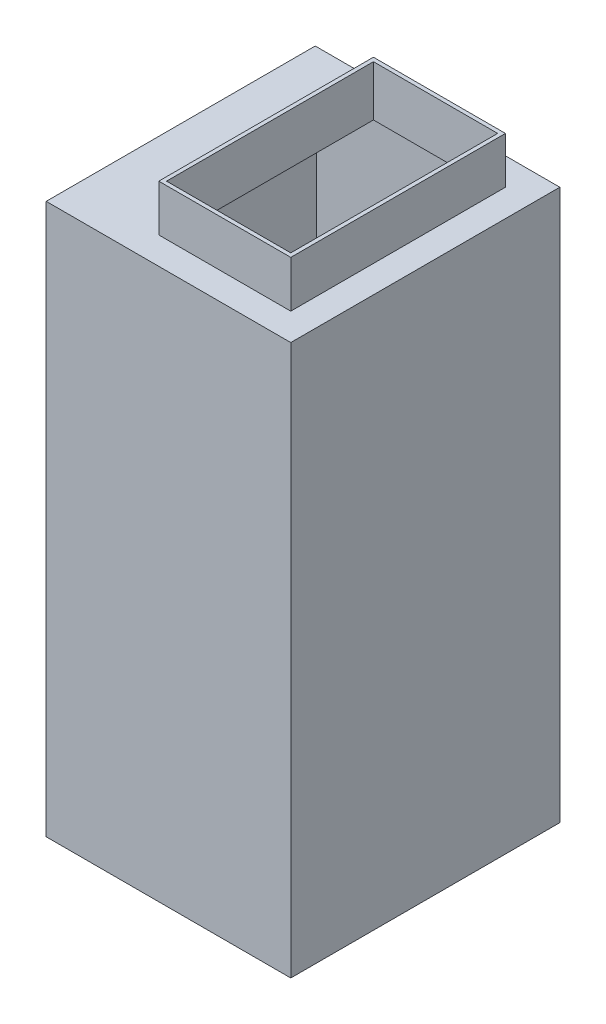
ISO-10303-21;
HEADER;
FILE_DESCRIPTION(('STEP AP214'),'2;1');
FILE_NAME('part.step','',(''),(''),'','','');
FILE_SCHEMA(('AUTOMOTIVE_DESIGN { 1 0 10303 214 1 1 1 1 }'));
ENDSEC;
DATA;
#1=APPLICATION_CONTEXT('core data for automotive mechanical design processes');
#2=APPLICATION_PROTOCOL_DEFINITION('international standard','automotive_design',2000,#1);
#3=PRODUCT_CONTEXT('',#1,'mechanical');
#4=PRODUCT('Part','Part','',(#3));
#5=PRODUCT_RELATED_PRODUCT_CATEGORY('part','',(#4));
#6=PRODUCT_DEFINITION_FORMATION('','',#4);
#7=PRODUCT_DEFINITION_CONTEXT('part definition',#1,'design');
#8=PRODUCT_DEFINITION('design','',#6,#7);
#9=PRODUCT_DEFINITION_SHAPE('','',#8);
#10=(LENGTH_UNIT() NAMED_UNIT(*) SI_UNIT(.MILLI.,.METRE.));
#11=(NAMED_UNIT(*) PLANE_ANGLE_UNIT() SI_UNIT($,.RADIAN.));
#12=(NAMED_UNIT(*) SI_UNIT($,.STERADIAN.) SOLID_ANGLE_UNIT());
#13=UNCERTAINTY_MEASURE_WITH_UNIT(LENGTH_MEASURE(1.E-05),#10,'distance_accuracy_value','');
#14=(GEOMETRIC_REPRESENTATION_CONTEXT(3) GLOBAL_UNCERTAINTY_ASSIGNED_CONTEXT((#13)) GLOBAL_UNIT_ASSIGNED_CONTEXT((#10,
#11,#12)) REPRESENTATION_CONTEXT('',''));
#15=CARTESIAN_POINT('',(0.,0.,0.));
#16=DIRECTION('',(0.,0.,1.));
#17=DIRECTION('',(1.,0.,0.));
#18=AXIS2_PLACEMENT_3D('',#15,#16,#17);
#19=CARTESIAN_POINT('',(-96.825,221.825,-108.));
#20=DIRECTION('',(-1.,0.,0.));
#21=DIRECTION('',(0.,-1.,0.));
#22=AXIS2_PLACEMENT_3D('',#19,#20,#21);
#23=PLANE('',#22);
#24=DIRECTION('',(0.,-1.,0.));
#25=VECTOR('',#24,1.);
#26=CARTESIAN_POINT('',(-96.825,221.825,108.));
#27=LINE('',#26,#25);
#28=CARTESIAN_POINT('',(-96.825,221.825,108.));
#29=VERTEX_POINT('',#28);
#30=CARTESIAN_POINT('',(-96.8249999999999,-221.825,108.));
#31=VERTEX_POINT('',#30);
#32=EDGE_CURVE('E218',#29,#31,#27,.T.);
#33=ORIENTED_EDGE('',*,*,#32,.T.);
#34=DIRECTION('',(0.,0.,1.));
#35=VECTOR('',#34,1.);
#36=CARTESIAN_POINT('',(-96.8249999999999,-221.825,-108.));
#37=LINE('',#36,#35);
#38=CARTESIAN_POINT('',(-96.8249999999999,-221.825,-108.));
#39=VERTEX_POINT('',#38);
#40=EDGE_CURVE('E232',#39,#31,#37,.T.);
#41=ORIENTED_EDGE('',*,*,#40,.F.);
#42=DIRECTION('',(0.,-1.,0.));
#43=VECTOR('',#42,1.);
#44=CARTESIAN_POINT('',(-96.825,221.825,-108.));
#45=LINE('',#44,#43);
#46=CARTESIAN_POINT('',(-96.825,221.825,-108.));
#47=VERTEX_POINT('',#46);
#48=EDGE_CURVE('E219',#47,#39,#45,.T.);
#49=ORIENTED_EDGE('',*,*,#48,.F.);
#50=DIRECTION('',(0.,0.,1.));
#51=VECTOR('',#50,1.);
#52=CARTESIAN_POINT('',(-96.825,221.825,-108.));
#53=LINE('',#52,#51);
#54=EDGE_CURVE('E243',#47,#29,#53,.T.);
#55=ORIENTED_EDGE('',*,*,#54,.T.);
#56=EDGE_LOOP('',(#33,#41,#49,#55));
#57=FACE_BOUND('',#56,.T.);
#58=ADVANCED_FACE('F36',(#57),#23,.F.);
#59=CARTESIAN_POINT('',(-96.825,221.825,-108.));
#60=DIRECTION('',(0.,1.,0.));
#61=DIRECTION('',(0.,0.,1.));
#62=AXIS2_PLACEMENT_3D('',#59,#60,#61);
#63=PLANE('',#62);
#64=DIRECTION('',(-1.,0.,0.));
#65=VECTOR('',#64,1.);
#66=CARTESIAN_POINT('',(-27.,221.825,-84.6));
#67=LINE('',#66,#65);
#68=CARTESIAN_POINT('',(74.6,221.825,-84.6));
#69=VERTEX_POINT('',#68);
#70=CARTESIAN_POINT('',(-27.,221.825,-84.6));
#71=VERTEX_POINT('',#70);
#72=EDGE_CURVE('E157',#69,#71,#67,.T.);
#73=ORIENTED_EDGE('',*,*,#72,.T.);
#74=DIRECTION('',(0.,0.,1.));
#75=VECTOR('',#74,1.);
#76=CARTESIAN_POINT('',(-27.,221.825,-84.6));
#77=LINE('',#76,#75);
#78=CARTESIAN_POINT('',(-27.,221.825,84.6));
#79=VERTEX_POINT('',#78);
#80=EDGE_CURVE('E151',#71,#79,#77,.T.);
#81=ORIENTED_EDGE('',*,*,#80,.T.);
#82=DIRECTION('',(1.,0.,0.));
#83=VECTOR('',#82,1.);
#84=CARTESIAN_POINT('',(-27.,221.825,84.6));
#85=LINE('',#84,#83);
#86=CARTESIAN_POINT('',(74.6,221.825,84.6));
#87=VERTEX_POINT('',#86);
#88=EDGE_CURVE('E160',#79,#87,#85,.T.);
#89=ORIENTED_EDGE('',*,*,#88,.T.);
#90=DIRECTION('',(0.,0.,-1.));
#91=VECTOR('',#90,1.);
#92=CARTESIAN_POINT('',(74.6,221.825,-84.6));
#93=LINE('',#92,#91);
#94=EDGE_CURVE('E51',#87,#69,#93,.T.);
#95=ORIENTED_EDGE('',*,*,#94,.T.);
#96=EDGE_LOOP('',(#73,#81,#89,#95));
#97=FACE_BOUND('',#96,.T.);
#98=DIRECTION('',(-1.,0.,0.));
#99=VECTOR('',#98,1.);
#100=CARTESIAN_POINT('',(-96.825,221.825,108.));
#101=LINE('',#100,#99);
#102=CARTESIAN_POINT('',(96.825,221.825,108.));
#103=VERTEX_POINT('',#102);
#104=EDGE_CURVE('E223',#103,#29,#101,.T.);
#105=ORIENTED_EDGE('',*,*,#104,.T.);
#106=ORIENTED_EDGE('',*,*,#54,.F.);
#107=DIRECTION('',(-1.,0.,0.));
#108=VECTOR('',#107,1.);
#109=CARTESIAN_POINT('',(-96.825,221.825,-108.));
#110=LINE('',#109,#108);
#111=CARTESIAN_POINT('',(96.825,221.825,-108.));
#112=VERTEX_POINT('',#111);
#113=EDGE_CURVE('E229',#112,#47,#110,.T.);
#114=ORIENTED_EDGE('',*,*,#113,.F.);
#115=DIRECTION('',(0.,0.,1.));
#116=VECTOR('',#115,1.);
#117=CARTESIAN_POINT('',(96.825,221.825,-108.));
#118=LINE('',#117,#116);
#119=EDGE_CURVE('E246',#112,#103,#118,.T.);
#120=ORIENTED_EDGE('',*,*,#119,.T.);
#121=EDGE_LOOP('',(#105,#106,#114,#120));
#122=FACE_BOUND('',#121,.T.);
#123=ADVANCED_FACE('F164',(#97,#122),#63,.F.);
#124=CARTESIAN_POINT('',(96.825,221.825,-108.));
#125=DIRECTION('',(1.,0.,0.));
#126=DIRECTION('',(0.,1.,0.));
#127=AXIS2_PLACEMENT_3D('',#124,#125,#126);
#128=PLANE('',#127);
#129=DIRECTION('',(0.,1.,0.));
#130=VECTOR('',#129,1.);
#131=CARTESIAN_POINT('',(96.825,221.825,108.));
#132=LINE('',#131,#130);
#133=CARTESIAN_POINT('',(96.8250000000001,-221.825,108.));
#134=VERTEX_POINT('',#133);
#135=EDGE_CURVE('E238',#134,#103,#132,.T.);
#136=ORIENTED_EDGE('',*,*,#135,.T.);
#137=ORIENTED_EDGE('',*,*,#119,.F.);
#138=DIRECTION('',(0.,1.,0.));
#139=VECTOR('',#138,1.);
#140=CARTESIAN_POINT('',(96.825,221.825,-108.));
#141=LINE('',#140,#139);
#142=CARTESIAN_POINT('',(96.8250000000001,-221.825,-108.));
#143=VERTEX_POINT('',#142);
#144=EDGE_CURVE('E226',#143,#112,#141,.T.);
#145=ORIENTED_EDGE('',*,*,#144,.F.);
#146=DIRECTION('',(0.,0.,1.));
#147=VECTOR('',#146,1.);
#148=CARTESIAN_POINT('',(96.8250000000001,-221.825,-108.));
#149=LINE('',#148,#147);
#150=EDGE_CURVE('E248',#143,#134,#149,.T.);
#151=ORIENTED_EDGE('',*,*,#150,.T.);
#152=EDGE_LOOP('',(#136,#137,#145,#151));
#153=FACE_BOUND('',#152,.T.);
#154=ADVANCED_FACE('F308',(#153),#128,.F.);
#155=CARTESIAN_POINT('',(-96.8249999999999,-221.825,-108.));
#156=DIRECTION('',(0.,-1.,0.));
#157=DIRECTION('',(0.,0.,-1.));
#158=AXIS2_PLACEMENT_3D('',#155,#156,#157);
#159=PLANE('',#158);
#160=DIRECTION('',(1.,0.,0.));
#161=VECTOR('',#160,1.);
#162=CARTESIAN_POINT('',(-96.8249999999999,-221.825,108.));
#163=LINE('',#162,#161);
#164=EDGE_CURVE('E235',#31,#134,#163,.T.);
#165=ORIENTED_EDGE('',*,*,#164,.T.);
#166=ORIENTED_EDGE('',*,*,#150,.F.);
#167=DIRECTION('',(1.,0.,0.));
#168=VECTOR('',#167,1.);
#169=CARTESIAN_POINT('',(-96.8249999999999,-221.825,-108.));
#170=LINE('',#169,#168);
#171=EDGE_CURVE('E222',#39,#143,#170,.T.);
#172=ORIENTED_EDGE('',*,*,#171,.F.);
#173=ORIENTED_EDGE('',*,*,#40,.T.);
#174=EDGE_LOOP('',(#165,#166,#172,#173));
#175=FACE_BOUND('',#174,.T.);
#176=ADVANCED_FACE('F312',(#175),#159,.F.);
#177=CARTESIAN_POINT('',(0.,0.,-108.));
#178=DIRECTION('',(0.,0.,1.));
#179=DIRECTION('',(1.,0.,0.));
#180=AXIS2_PLACEMENT_3D('',#177,#178,#179);
#181=PLANE('',#180);
#182=ORIENTED_EDGE('',*,*,#48,.T.);
#183=ORIENTED_EDGE('',*,*,#171,.T.);
#184=ORIENTED_EDGE('',*,*,#144,.T.);
#185=ORIENTED_EDGE('',*,*,#113,.T.);
#186=EDGE_LOOP('',(#182,#183,#184,#185));
#187=FACE_BOUND('',#186,.T.);
#188=ADVANCED_FACE('F354',(#187),#181,.T.);
#189=CARTESIAN_POINT('',(0.,0.,108.));
#190=DIRECTION('',(0.,0.,1.));
#191=DIRECTION('',(1.,0.,0.));
#192=AXIS2_PLACEMENT_3D('',#189,#190,#191);
#193=PLANE('',#192);
#194=ORIENTED_EDGE('',*,*,#32,.F.);
#195=ORIENTED_EDGE('',*,*,#104,.F.);
#196=ORIENTED_EDGE('',*,*,#135,.F.);
#197=ORIENTED_EDGE('',*,*,#164,.F.);
#198=EDGE_LOOP('',(#194,#195,#196,#197));
#199=FACE_BOUND('',#198,.T.);
#200=ADVANCED_FACE('F334',(#199),#193,.F.);
#201=CARTESIAN_POINT('',(-27.,221.825,-84.6));
#202=DIRECTION('',(-1.,0.,0.));
#203=DIRECTION('',(0.,0.,1.));
#204=AXIS2_PLACEMENT_3D('',#201,#202,#203);
#205=PLANE('',#204);
#206=DIRECTION('',(0.,0.,1.));
#207=VECTOR('',#206,1.);
#208=CARTESIAN_POINT('',(-27.,263.1,-84.6));
#209=LINE('',#208,#207);
#210=CARTESIAN_POINT('',(-27.,263.1,-84.6));
#211=VERTEX_POINT('',#210);
#212=CARTESIAN_POINT('',(-27.,263.1,84.6));
#213=VERTEX_POINT('',#212);
#214=EDGE_CURVE('E59',#211,#213,#209,.T.);
#215=ORIENTED_EDGE('',*,*,#214,.T.);
#216=DIRECTION('',(0.,1.,0.));
#217=VECTOR('',#216,1.);
#218=CARTESIAN_POINT('',(-27.,221.825,84.6));
#219=LINE('',#218,#217);
#220=EDGE_CURVE('E147',#79,#213,#219,.T.);
#221=ORIENTED_EDGE('',*,*,#220,.F.);
#222=ORIENTED_EDGE('',*,*,#80,.F.);
#223=DIRECTION('',(0.,1.,0.));
#224=VECTOR('',#223,1.);
#225=CARTESIAN_POINT('',(-27.,221.825,-84.6));
#226=LINE('',#225,#224);
#227=EDGE_CURVE('E180',#71,#211,#226,.T.);
#228=ORIENTED_EDGE('',*,*,#227,.T.);
#229=EDGE_LOOP('',(#215,#221,#222,#228));
#230=FACE_BOUND('',#229,.T.);
#231=ADVANCED_FACE('F149',(#230),#205,.F.);
#232=CARTESIAN_POINT('',(-27.,221.825,-84.6));
#233=DIRECTION('',(0.,0.,-1.));
#234=DIRECTION('',(-1.,0.,0.));
#235=AXIS2_PLACEMENT_3D('',#232,#233,#234);
#236=PLANE('',#235);
#237=DIRECTION('',(-1.,0.,0.));
#238=VECTOR('',#237,1.);
#239=CARTESIAN_POINT('',(-27.,263.1,-84.6));
#240=LINE('',#239,#238);
#241=CARTESIAN_POINT('',(74.6,263.1,-84.6));
#242=VERTEX_POINT('',#241);
#243=EDGE_CURVE('E167',#242,#211,#240,.T.);
#244=ORIENTED_EDGE('',*,*,#243,.T.);
#245=ORIENTED_EDGE('',*,*,#227,.F.);
#246=ORIENTED_EDGE('',*,*,#72,.F.);
#247=DIRECTION('',(0.,1.,0.));
#248=VECTOR('',#247,1.);
#249=CARTESIAN_POINT('',(74.6,221.825,-84.6));
#250=LINE('',#249,#248);
#251=EDGE_CURVE('E183',#69,#242,#250,.T.);
#252=ORIENTED_EDGE('',*,*,#251,.T.);
#253=EDGE_LOOP('',(#244,#245,#246,#252));
#254=FACE_BOUND('',#253,.T.);
#255=ADVANCED_FACE('F328',(#254),#236,.F.);
#256=CARTESIAN_POINT('',(74.6,221.825,-84.6));
#257=DIRECTION('',(1.,0.,0.));
#258=DIRECTION('',(0.,0.,-1.));
#259=AXIS2_PLACEMENT_3D('',#256,#257,#258);
#260=PLANE('',#259);
#261=DIRECTION('',(0.,0.,-1.));
#262=VECTOR('',#261,1.);
#263=CARTESIAN_POINT('',(74.6,263.1,-84.6));
#264=LINE('',#263,#262);
#265=CARTESIAN_POINT('',(74.6,263.1,84.6));
#266=VERTEX_POINT('',#265);
#267=EDGE_CURVE('E170',#266,#242,#264,.T.);
#268=ORIENTED_EDGE('',*,*,#267,.T.);
#269=ORIENTED_EDGE('',*,*,#251,.F.);
#270=ORIENTED_EDGE('',*,*,#94,.F.);
#271=DIRECTION('',(0.,1.,0.));
#272=VECTOR('',#271,1.);
#273=CARTESIAN_POINT('',(74.6,221.825,84.6));
#274=LINE('',#273,#272);
#275=EDGE_CURVE('E156',#87,#266,#274,.T.);
#276=ORIENTED_EDGE('',*,*,#275,.T.);
#277=EDGE_LOOP('',(#268,#269,#270,#276));
#278=FACE_BOUND('',#277,.T.);
#279=ADVANCED_FACE('F323',(#278),#260,.F.);
#280=CARTESIAN_POINT('',(-27.,221.825,84.6));
#281=DIRECTION('',(0.,0.,1.));
#282=DIRECTION('',(1.,0.,0.));
#283=AXIS2_PLACEMENT_3D('',#280,#281,#282);
#284=PLANE('',#283);
#285=DIRECTION('',(1.,0.,0.));
#286=VECTOR('',#285,1.);
#287=CARTESIAN_POINT('',(-27.,263.1,84.6));
#288=LINE('',#287,#286);
#289=EDGE_CURVE('E176',#213,#266,#288,.T.);
#290=ORIENTED_EDGE('',*,*,#289,.T.);
#291=ORIENTED_EDGE('',*,*,#275,.F.);
#292=ORIENTED_EDGE('',*,*,#88,.F.);
#293=ORIENTED_EDGE('',*,*,#220,.T.);
#294=EDGE_LOOP('',(#290,#291,#292,#293));
#295=FACE_BOUND('',#294,.T.);
#296=ADVANCED_FACE('F161',(#295),#284,.F.);
#297=CARTESIAN_POINT('',(-100.,225.,110.));
#298=DIRECTION('',(0.,-1.,0.));
#299=DIRECTION('',(0.,0.,-1.));
#300=AXIS2_PLACEMENT_3D('',#297,#298,#299);
#301=PLANE('',#300);
#302=DIRECTION('',(-1.,0.,0.));
#303=VECTOR('',#302,1.);
#304=CARTESIAN_POINT('',(-100.,225.,-110.));
#305=LINE('',#304,#303);
#306=CARTESIAN_POINT('',(100.,225.,-110.));
#307=VERTEX_POINT('',#306);
#308=CARTESIAN_POINT('',(-100.,225.,-110.));
#309=VERTEX_POINT('',#308);
#310=EDGE_CURVE('E255',#307,#309,#305,.T.);
#311=ORIENTED_EDGE('',*,*,#310,.T.);
#312=DIRECTION('',(0.,0.,-1.));
#313=VECTOR('',#312,1.);
#314=CARTESIAN_POINT('',(-100.,225.,110.));
#315=LINE('',#314,#313);
#316=CARTESIAN_POINT('',(-100.,225.,110.));
#317=VERTEX_POINT('',#316);
#318=EDGE_CURVE('E261',#317,#309,#315,.T.);
#319=ORIENTED_EDGE('',*,*,#318,.F.);
#320=DIRECTION('',(-1.,0.,0.));
#321=VECTOR('',#320,1.);
#322=CARTESIAN_POINT('',(-100.,225.,110.));
#323=LINE('',#322,#321);
#324=CARTESIAN_POINT('',(100.,225.,110.));
#325=VERTEX_POINT('',#324);
#326=EDGE_CURVE('E259',#325,#317,#323,.T.);
#327=ORIENTED_EDGE('',*,*,#326,.F.);
#328=DIRECTION('',(0.,0.,-1.));
#329=VECTOR('',#328,1.);
#330=CARTESIAN_POINT('',(100.,225.,110.));
#331=LINE('',#330,#329);
#332=EDGE_CURVE('E271',#325,#307,#331,.T.);
#333=ORIENTED_EDGE('',*,*,#332,.T.);
#334=EDGE_LOOP('',(#311,#319,#327,#333));
#335=FACE_BOUND('',#334,.T.);
#336=DIRECTION('',(0.,0.,1.));
#337=VECTOR('',#336,1.);
#338=CARTESIAN_POINT('',(-30.175,225.,-87.775));
#339=LINE('',#338,#337);
#340=CARTESIAN_POINT('',(-30.175,225.,-87.775));
#341=VERTEX_POINT('',#340);
#342=CARTESIAN_POINT('',(-30.175,225.,87.775));
#343=VERTEX_POINT('',#342);
#344=EDGE_CURVE('E182',#341,#343,#339,.T.);
#345=ORIENTED_EDGE('',*,*,#344,.F.);
#346=DIRECTION('',(-1.,0.,0.));
#347=VECTOR('',#346,1.);
#348=CARTESIAN_POINT('',(-30.175,225.,-87.775));
#349=LINE('',#348,#347);
#350=CARTESIAN_POINT('',(77.775,225.,-87.775));
#351=VERTEX_POINT('',#350);
#352=EDGE_CURVE('E190',#351,#341,#349,.T.);
#353=ORIENTED_EDGE('',*,*,#352,.F.);
#354=DIRECTION('',(0.,0.,-1.));
#355=VECTOR('',#354,1.);
#356=CARTESIAN_POINT('',(77.775,225.,-87.775));
#357=LINE('',#356,#355);
#358=CARTESIAN_POINT('',(77.775,225.,87.775));
#359=VERTEX_POINT('',#358);
#360=EDGE_CURVE('E202',#359,#351,#357,.T.);
#361=ORIENTED_EDGE('',*,*,#360,.F.);
#362=DIRECTION('',(1.,0.,0.));
#363=VECTOR('',#362,1.);
#364=CARTESIAN_POINT('',(-30.175,225.,87.775));
#365=LINE('',#364,#363);
#366=EDGE_CURVE('E199',#343,#359,#365,.T.);
#367=ORIENTED_EDGE('',*,*,#366,.F.);
#368=EDGE_LOOP('',(#345,#353,#361,#367));
#369=FACE_BOUND('',#368,.T.);
#370=ADVANCED_FACE('F287',(#335,#369),#301,.F.);
#371=CARTESIAN_POINT('',(-100.,225.,110.));
#372=DIRECTION('',(1.,0.,0.));
#373=DIRECTION('',(0.,0.,-1.));
#374=AXIS2_PLACEMENT_3D('',#371,#372,#373);
#375=PLANE('',#374);
#376=DIRECTION('',(0.,-1.,0.));
#377=VECTOR('',#376,1.);
#378=CARTESIAN_POINT('',(-100.,225.,-110.));
#379=LINE('',#378,#377);
#380=CARTESIAN_POINT('',(-100.,-225.,-110.));
#381=VERTEX_POINT('',#380);
#382=EDGE_CURVE('E245',#309,#381,#379,.T.);
#383=ORIENTED_EDGE('',*,*,#382,.T.);
#384=DIRECTION('',(0.,0.,-1.));
#385=VECTOR('',#384,1.);
#386=CARTESIAN_POINT('',(-100.,-225.,110.));
#387=LINE('',#386,#385);
#388=CARTESIAN_POINT('',(-100.,-225.,110.));
#389=VERTEX_POINT('',#388);
#390=EDGE_CURVE('E11',#389,#381,#387,.T.);
#391=ORIENTED_EDGE('',*,*,#390,.F.);
#392=DIRECTION('',(0.,-1.,0.));
#393=VECTOR('',#392,1.);
#394=CARTESIAN_POINT('',(-100.,225.,110.));
#395=LINE('',#394,#393);
#396=EDGE_CURVE('E251',#317,#389,#395,.T.);
#397=ORIENTED_EDGE('',*,*,#396,.F.);
#398=ORIENTED_EDGE('',*,*,#318,.T.);
#399=EDGE_LOOP('',(#383,#391,#397,#398));
#400=FACE_BOUND('',#399,.T.);
#401=ADVANCED_FACE('F38',(#400),#375,.F.);
#402=CARTESIAN_POINT('',(-100.,-225.,110.));
#403=DIRECTION('',(0.,1.,0.));
#404=DIRECTION('',(0.,0.,1.));
#405=AXIS2_PLACEMENT_3D('',#402,#403,#404);
#406=PLANE('',#405);
#407=DIRECTION('',(1.,0.,0.));
#408=VECTOR('',#407,1.);
#409=CARTESIAN_POINT('',(-100.,-225.,-110.));
#410=LINE('',#409,#408);
#411=CARTESIAN_POINT('',(100.,-225.,-110.));
#412=VERTEX_POINT('',#411);
#413=EDGE_CURVE('E264',#381,#412,#410,.T.);
#414=ORIENTED_EDGE('',*,*,#413,.T.);
#415=DIRECTION('',(0.,0.,-1.));
#416=VECTOR('',#415,1.);
#417=CARTESIAN_POINT('',(100.,-225.,110.));
#418=LINE('',#417,#416);
#419=CARTESIAN_POINT('',(100.,-225.,110.));
#420=VERTEX_POINT('',#419);
#421=EDGE_CURVE('E44',#420,#412,#418,.T.);
#422=ORIENTED_EDGE('',*,*,#421,.F.);
#423=DIRECTION('',(1.,0.,0.));
#424=VECTOR('',#423,1.);
#425=CARTESIAN_POINT('',(-100.,-225.,110.));
#426=LINE('',#425,#424);
#427=EDGE_CURVE('E254',#389,#420,#426,.T.);
#428=ORIENTED_EDGE('',*,*,#427,.F.);
#429=ORIENTED_EDGE('',*,*,#390,.T.);
#430=EDGE_LOOP('',(#414,#422,#428,#429));
#431=FACE_BOUND('',#430,.T.);
#432=ADVANCED_FACE('F295',(#431),#406,.F.);
#433=CARTESIAN_POINT('',(100.,225.,110.));
#434=DIRECTION('',(-1.,0.,0.));
#435=DIRECTION('',(0.,0.,1.));
#436=AXIS2_PLACEMENT_3D('',#433,#434,#435);
#437=PLANE('',#436);
#438=DIRECTION('',(0.,1.,0.));
#439=VECTOR('',#438,1.);
#440=CARTESIAN_POINT('',(100.,225.,-110.));
#441=LINE('',#440,#439);
#442=EDGE_CURVE('E266',#412,#307,#441,.T.);
#443=ORIENTED_EDGE('',*,*,#442,.T.);
#444=ORIENTED_EDGE('',*,*,#332,.F.);
#445=DIRECTION('',(0.,1.,0.));
#446=VECTOR('',#445,1.);
#447=CARTESIAN_POINT('',(100.,225.,110.));
#448=LINE('',#447,#446);
#449=EDGE_CURVE('E257',#420,#325,#448,.T.);
#450=ORIENTED_EDGE('',*,*,#449,.F.);
#451=ORIENTED_EDGE('',*,*,#421,.T.);
#452=EDGE_LOOP('',(#443,#444,#450,#451));
#453=FACE_BOUND('',#452,.T.);
#454=ADVANCED_FACE('F278',(#453),#437,.F.);
#455=CARTESIAN_POINT('',(0.,0.,110.));
#456=DIRECTION('',(0.,0.,1.));
#457=DIRECTION('',(1.,0.,0.));
#458=AXIS2_PLACEMENT_3D('',#455,#456,#457);
#459=PLANE('',#458);
#460=ORIENTED_EDGE('',*,*,#396,.T.);
#461=ORIENTED_EDGE('',*,*,#427,.T.);
#462=ORIENTED_EDGE('',*,*,#449,.T.);
#463=ORIENTED_EDGE('',*,*,#326,.T.);
#464=EDGE_LOOP('',(#460,#461,#462,#463));
#465=FACE_BOUND('',#464,.T.);
#466=ADVANCED_FACE('F294',(#465),#459,.T.);
#467=CARTESIAN_POINT('',(0.,0.,-110.));
#468=DIRECTION('',(0.,0.,1.));
#469=DIRECTION('',(1.,0.,0.));
#470=AXIS2_PLACEMENT_3D('',#467,#468,#469);
#471=PLANE('',#470);
#472=ORIENTED_EDGE('',*,*,#382,.F.);
#473=ORIENTED_EDGE('',*,*,#310,.F.);
#474=ORIENTED_EDGE('',*,*,#442,.F.);
#475=ORIENTED_EDGE('',*,*,#413,.F.);
#476=EDGE_LOOP('',(#472,#473,#474,#475));
#477=FACE_BOUND('',#476,.T.);
#478=ADVANCED_FACE('F284',(#477),#471,.F.);
#479=CARTESIAN_POINT('',(-30.175,263.1,-87.775));
#480=DIRECTION('',(1.,0.,0.));
#481=DIRECTION('',(0.,0.,-1.));
#482=AXIS2_PLACEMENT_3D('',#479,#480,#481);
#483=PLANE('',#482);
#484=ORIENTED_EDGE('',*,*,#344,.T.);
#485=DIRECTION('',(0.,-1.,0.));
#486=VECTOR('',#485,1.);
#487=CARTESIAN_POINT('',(-30.175,263.1,87.775));
#488=LINE('',#487,#486);
#489=CARTESIAN_POINT('',(-30.175,263.1,87.775));
#490=VERTEX_POINT('',#489);
#491=EDGE_CURVE('E215',#490,#343,#488,.T.);
#492=ORIENTED_EDGE('',*,*,#491,.F.);
#493=DIRECTION('',(0.,0.,1.));
#494=VECTOR('',#493,1.);
#495=CARTESIAN_POINT('',(-30.175,263.1,-87.775));
#496=LINE('',#495,#494);
#497=CARTESIAN_POINT('',(-30.175,263.1,-87.775));
#498=VERTEX_POINT('',#497);
#499=EDGE_CURVE('E186',#498,#490,#496,.T.);
#500=ORIENTED_EDGE('',*,*,#499,.F.);
#501=DIRECTION('',(0.,-1.,0.));
#502=VECTOR('',#501,1.);
#503=CARTESIAN_POINT('',(-30.175,263.1,-87.775));
#504=LINE('',#503,#502);
#505=EDGE_CURVE('E196',#498,#341,#504,.T.);
#506=ORIENTED_EDGE('',*,*,#505,.T.);
#507=EDGE_LOOP('',(#484,#492,#500,#506));
#508=FACE_BOUND('',#507,.T.);
#509=ADVANCED_FACE('F318',(#508),#483,.F.);
#510=CARTESIAN_POINT('',(-30.175,263.1,87.775));
#511=DIRECTION('',(0.,0.,-1.));
#512=DIRECTION('',(-1.,0.,0.));
#513=AXIS2_PLACEMENT_3D('',#510,#511,#512);
#514=PLANE('',#513);
#515=ORIENTED_EDGE('',*,*,#366,.T.);
#516=DIRECTION('',(0.,-1.,0.));
#517=VECTOR('',#516,1.);
#518=CARTESIAN_POINT('',(77.775,263.1,87.775));
#519=LINE('',#518,#517);
#520=CARTESIAN_POINT('',(77.775,263.1,87.775));
#521=VERTEX_POINT('',#520);
#522=EDGE_CURVE('E212',#521,#359,#519,.T.);
#523=ORIENTED_EDGE('',*,*,#522,.F.);
#524=DIRECTION('',(1.,0.,0.));
#525=VECTOR('',#524,1.);
#526=CARTESIAN_POINT('',(-30.175,263.1,87.775));
#527=LINE('',#526,#525);
#528=EDGE_CURVE('E189',#490,#521,#527,.T.);
#529=ORIENTED_EDGE('',*,*,#528,.F.);
#530=ORIENTED_EDGE('',*,*,#491,.T.);
#531=EDGE_LOOP('',(#515,#523,#529,#530));
#532=FACE_BOUND('',#531,.T.);
#533=ADVANCED_FACE('F346',(#532),#514,.F.);
#534=CARTESIAN_POINT('',(77.775,263.1,-87.775));
#535=DIRECTION('',(-1.,0.,0.));
#536=DIRECTION('',(0.,0.,1.));
#537=AXIS2_PLACEMENT_3D('',#534,#535,#536);
#538=PLANE('',#537);
#539=ORIENTED_EDGE('',*,*,#360,.T.);
#540=DIRECTION('',(0.,-1.,0.));
#541=VECTOR('',#540,1.);
#542=CARTESIAN_POINT('',(77.775,263.1,-87.775));
#543=LINE('',#542,#541);
#544=CARTESIAN_POINT('',(77.775,263.1,-87.775));
#545=VERTEX_POINT('',#544);
#546=EDGE_CURVE('E209',#545,#351,#543,.T.);
#547=ORIENTED_EDGE('',*,*,#546,.F.);
#548=DIRECTION('',(0.,0.,-1.));
#549=VECTOR('',#548,1.);
#550=CARTESIAN_POINT('',(77.775,263.1,-87.775));
#551=LINE('',#550,#549);
#552=EDGE_CURVE('E192',#521,#545,#551,.T.);
#553=ORIENTED_EDGE('',*,*,#552,.F.);
#554=ORIENTED_EDGE('',*,*,#522,.T.);
#555=EDGE_LOOP('',(#539,#547,#553,#554));
#556=FACE_BOUND('',#555,.T.);
#557=ADVANCED_FACE('F342',(#556),#538,.F.);
#558=CARTESIAN_POINT('',(-30.175,263.1,-87.775));
#559=DIRECTION('',(0.,0.,1.));
#560=DIRECTION('',(1.,0.,0.));
#561=AXIS2_PLACEMENT_3D('',#558,#559,#560);
#562=PLANE('',#561);
#563=ORIENTED_EDGE('',*,*,#352,.T.);
#564=ORIENTED_EDGE('',*,*,#505,.F.);
#565=DIRECTION('',(-1.,0.,0.));
#566=VECTOR('',#565,1.);
#567=CARTESIAN_POINT('',(-30.175,263.1,-87.775));
#568=LINE('',#567,#566);
#569=EDGE_CURVE('E194',#545,#498,#568,.T.);
#570=ORIENTED_EDGE('',*,*,#569,.F.);
#571=ORIENTED_EDGE('',*,*,#546,.T.);
#572=EDGE_LOOP('',(#563,#564,#570,#571));
#573=FACE_BOUND('',#572,.T.);
#574=ADVANCED_FACE('F338',(#573),#562,.F.);
#575=CARTESIAN_POINT('',(0.,263.1,0.));
#576=DIRECTION('',(0.,1.,0.));
#577=DIRECTION('',(0.,0.,1.));
#578=AXIS2_PLACEMENT_3D('',#575,#576,#577);
#579=PLANE('',#578);
#580=ORIENTED_EDGE('',*,*,#214,.F.);
#581=ORIENTED_EDGE('',*,*,#243,.F.);
#582=ORIENTED_EDGE('',*,*,#267,.F.);
#583=ORIENTED_EDGE('',*,*,#289,.F.);
#584=EDGE_LOOP('',(#580,#581,#582,#583));
#585=FACE_BOUND('',#584,.T.);
#586=ORIENTED_EDGE('',*,*,#499,.T.);
#587=ORIENTED_EDGE('',*,*,#528,.T.);
#588=ORIENTED_EDGE('',*,*,#552,.T.);
#589=ORIENTED_EDGE('',*,*,#569,.T.);
#590=EDGE_LOOP('',(#586,#587,#588,#589));
#591=FACE_BOUND('',#590,.T.);
#592=ADVANCED_FACE('F335',(#585,#591),#579,.T.);
#593=CLOSED_SHELL('',(#58,#123,#154,#176,#188,#200,#231,#255,#279,#296,#370,#401,#432,#454,#466,
#478,#509,#533,#557,#574,#592));
#594=MANIFOLD_SOLID_BREP('B2',#593);
#595=ADVANCED_BREP_SHAPE_REPRESENTATION('',(#18,#594),#14);
#596=SHAPE_DEFINITION_REPRESENTATION(#9,#595);
ENDSEC;
END-ISO-10303-21;
